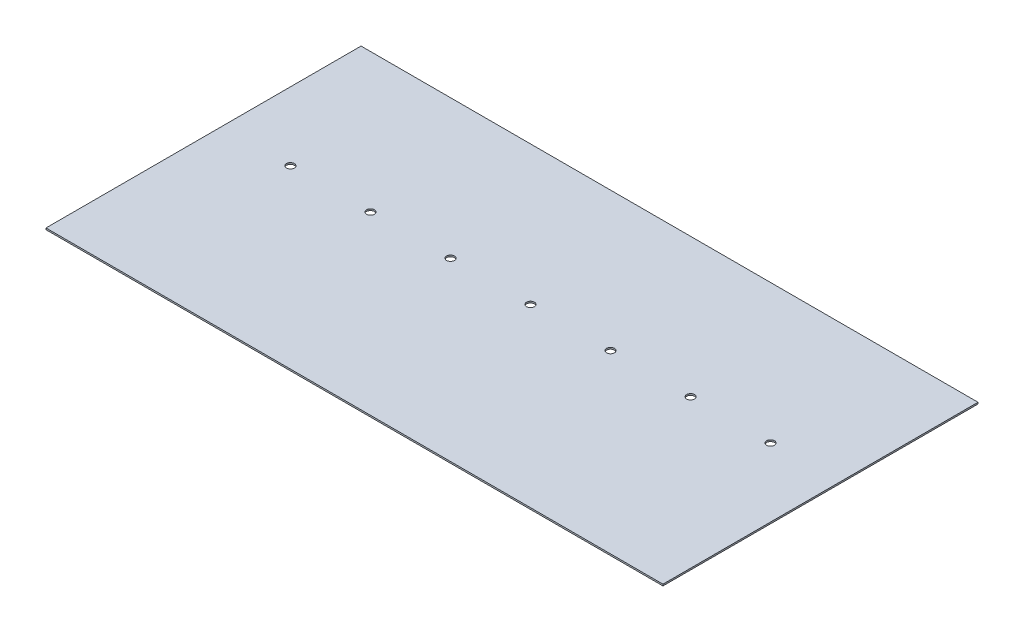
ISO-10303-21;
HEADER;
FILE_DESCRIPTION(('STEP AP214'),'2;1');
FILE_NAME('part.step','',(''),(''),'','','');
FILE_SCHEMA(('AUTOMOTIVE_DESIGN { 1 0 10303 214 1 1 1 1 }'));
ENDSEC;
DATA;
#1=APPLICATION_CONTEXT('core data for automotive mechanical design processes');
#2=APPLICATION_PROTOCOL_DEFINITION('international standard','automotive_design',2000,#1);
#3=PRODUCT_CONTEXT('',#1,'mechanical');
#4=PRODUCT('Part','Part','',(#3));
#5=PRODUCT_RELATED_PRODUCT_CATEGORY('part','',(#4));
#6=PRODUCT_DEFINITION_FORMATION('','',#4);
#7=PRODUCT_DEFINITION_CONTEXT('part definition',#1,'design');
#8=PRODUCT_DEFINITION('design','',#6,#7);
#9=PRODUCT_DEFINITION_SHAPE('','',#8);
#10=(LENGTH_UNIT() NAMED_UNIT(*) SI_UNIT(.MILLI.,.METRE.));
#11=(NAMED_UNIT(*) PLANE_ANGLE_UNIT() SI_UNIT($,.RADIAN.));
#12=(NAMED_UNIT(*) SI_UNIT($,.STERADIAN.) SOLID_ANGLE_UNIT());
#13=UNCERTAINTY_MEASURE_WITH_UNIT(LENGTH_MEASURE(1.E-05),#10,'distance_accuracy_value','');
#14=(GEOMETRIC_REPRESENTATION_CONTEXT(3) GLOBAL_UNCERTAINTY_ASSIGNED_CONTEXT((#13)) GLOBAL_UNIT_ASSIGNED_CONTEXT((#10,
#11,#12)) REPRESENTATION_CONTEXT('',''));
#15=CARTESIAN_POINT('',(0.,0.,0.));
#16=DIRECTION('',(0.,0.,1.));
#17=DIRECTION('',(1.,0.,0.));
#18=AXIS2_PLACEMENT_3D('',#15,#16,#17);
#19=CARTESIAN_POINT('',(391.668,-1.,0.));
#20=DIRECTION('',(-1.,0.,0.));
#21=DIRECTION('',(0.,0.,1.));
#22=AXIS2_PLACEMENT_3D('',#19,#20,#21);
#23=PLANE('',#22);
#24=DIRECTION('',(0.,0.,1.));
#25=VECTOR('',#24,1.);
#26=CARTESIAN_POINT('',(391.668,0.,0.));
#27=LINE('',#26,#25);
#28=CARTESIAN_POINT('',(391.668,0.,0.));
#29=VERTEX_POINT('',#28);
#30=CARTESIAN_POINT('',(391.668,0.,199.9996));
#31=VERTEX_POINT('',#30);
#32=EDGE_CURVE('E118',#29,#31,#27,.T.);
#33=ORIENTED_EDGE('',*,*,#32,.T.);
#34=DIRECTION('',(0.,1.,0.));
#35=VECTOR('',#34,1.);
#36=CARTESIAN_POINT('',(391.668,-1.,199.9996));
#37=LINE('',#36,#35);
#38=CARTESIAN_POINT('',(391.668,-1.,199.9996));
#39=VERTEX_POINT('',#38);
#40=EDGE_CURVE('E11',#39,#31,#37,.T.);
#41=ORIENTED_EDGE('',*,*,#40,.F.);
#42=DIRECTION('',(0.,0.,1.));
#43=VECTOR('',#42,1.);
#44=CARTESIAN_POINT('',(391.668,-1.,0.));
#45=LINE('',#44,#43);
#46=CARTESIAN_POINT('',(391.668,-1.,0.));
#47=VERTEX_POINT('',#46);
#48=EDGE_CURVE('E53',#47,#39,#45,.T.);
#49=ORIENTED_EDGE('',*,*,#48,.F.);
#50=DIRECTION('',(0.,1.,0.));
#51=VECTOR('',#50,1.);
#52=CARTESIAN_POINT('',(391.668,-1.,0.));
#53=LINE('',#52,#51);
#54=EDGE_CURVE('E38',#47,#29,#53,.T.);
#55=ORIENTED_EDGE('',*,*,#54,.T.);
#56=EDGE_LOOP('',(#33,#41,#49,#55));
#57=FACE_BOUND('',#56,.T.);
#58=ADVANCED_FACE('F34',(#57),#23,.F.);
#59=CARTESIAN_POINT('',(0.,-1.,199.9996));
#60=DIRECTION('',(0.,0.,1.));
#61=DIRECTION('',(1.,0.,0.));
#62=AXIS2_PLACEMENT_3D('',#59,#60,#61);
#63=PLANE('',#62);
#64=DIRECTION('',(1.,0.,0.));
#65=VECTOR('',#64,1.);
#66=CARTESIAN_POINT('',(0.,0.,199.9996));
#67=LINE('',#66,#65);
#68=CARTESIAN_POINT('',(0.,0.,199.9996));
#69=VERTEX_POINT('',#68);
#70=EDGE_CURVE('E123',#69,#31,#67,.T.);
#71=ORIENTED_EDGE('',*,*,#70,.F.);
#72=DIRECTION('',(0.,1.,0.));
#73=VECTOR('',#72,1.);
#74=CARTESIAN_POINT('',(0.,-1.,199.9996));
#75=LINE('',#74,#73);
#76=CARTESIAN_POINT('',(0.,-1.,199.9996));
#77=VERTEX_POINT('',#76);
#78=EDGE_CURVE('E44',#77,#69,#75,.T.);
#79=ORIENTED_EDGE('',*,*,#78,.F.);
#80=DIRECTION('',(1.,0.,0.));
#81=VECTOR('',#80,1.);
#82=CARTESIAN_POINT('',(0.,-1.,199.9996));
#83=LINE('',#82,#81);
#84=EDGE_CURVE('E92',#77,#39,#83,.T.);
#85=ORIENTED_EDGE('',*,*,#84,.T.);
#86=ORIENTED_EDGE('',*,*,#40,.T.);
#87=EDGE_LOOP('',(#71,#79,#85,#86));
#88=FACE_BOUND('',#87,.T.);
#89=ADVANCED_FACE('F166',(#88),#63,.T.);
#90=CARTESIAN_POINT('',(0.,-1.,0.));
#91=DIRECTION('',(-1.,0.,0.));
#92=DIRECTION('',(0.,0.,1.));
#93=AXIS2_PLACEMENT_3D('',#90,#91,#92);
#94=PLANE('',#93);
#95=DIRECTION('',(0.,0.,1.));
#96=VECTOR('',#95,1.);
#97=CARTESIAN_POINT('',(0.,0.,0.));
#98=LINE('',#97,#96);
#99=CARTESIAN_POINT('',(0.,0.,0.));
#100=VERTEX_POINT('',#99);
#101=EDGE_CURVE('E85',#100,#69,#98,.T.);
#102=ORIENTED_EDGE('',*,*,#101,.F.);
#103=DIRECTION('',(0.,1.,0.));
#104=VECTOR('',#103,1.);
#105=CARTESIAN_POINT('',(0.,-1.,0.));
#106=LINE('',#105,#104);
#107=CARTESIAN_POINT('',(0.,-1.,0.));
#108=VERTEX_POINT('',#107);
#109=EDGE_CURVE('E82',#108,#100,#106,.T.);
#110=ORIENTED_EDGE('',*,*,#109,.F.);
#111=DIRECTION('',(0.,0.,1.));
#112=VECTOR('',#111,1.);
#113=CARTESIAN_POINT('',(0.,-1.,0.));
#114=LINE('',#113,#112);
#115=EDGE_CURVE('E84',#108,#77,#114,.T.);
#116=ORIENTED_EDGE('',*,*,#115,.T.);
#117=ORIENTED_EDGE('',*,*,#78,.T.);
#118=EDGE_LOOP('',(#102,#110,#116,#117));
#119=FACE_BOUND('',#118,.T.);
#120=ADVANCED_FACE('F83',(#119),#94,.T.);
#121=CARTESIAN_POINT('',(195.834,-1.,88.2396));
#122=DIRECTION('',(0.,1.,0.));
#123=DIRECTION('',(0.,0.,1.));
#124=AXIS2_PLACEMENT_3D('',#121,#122,#123);
#125=CYLINDRICAL_SURFACE('',#124,2.5);
#126=CARTESIAN_POINT('',(195.834,-1.,88.2396));
#127=DIRECTION('',(0.,1.,0.));
#128=DIRECTION('',(0.,0.,1.));
#129=AXIS2_PLACEMENT_3D('',#126,#127,#128);
#130=CIRCLE('',#129,2.5);
#131=CARTESIAN_POINT('',(195.834,-1.,90.7396));
#132=VERTEX_POINT('',#131);
#133=EDGE_CURVE('E149',#132,#132,#130,.T.);
#134=ORIENTED_EDGE('',*,*,#133,.F.);
#135=EDGE_LOOP('',(#134));
#136=FACE_BOUND('',#135,.T.);
#137=CARTESIAN_POINT('',(195.834,0.,88.2396));
#138=DIRECTION('',(0.,1.,0.));
#139=DIRECTION('',(0.,0.,1.));
#140=AXIS2_PLACEMENT_3D('',#137,#138,#139);
#141=CIRCLE('',#140,2.5);
#142=CARTESIAN_POINT('',(195.834,0.,90.7396));
#143=VERTEX_POINT('',#142);
#144=EDGE_CURVE('E115',#143,#143,#141,.T.);
#145=ORIENTED_EDGE('',*,*,#144,.T.);
#146=EDGE_LOOP('',(#145));
#147=FACE_BOUND('',#146,.T.);
#148=ADVANCED_FACE('F154',(#136,#147),#125,.F.);
#149=CARTESIAN_POINT('',(145.034,-1.,88.2396));
#150=DIRECTION('',(0.,1.,0.));
#151=DIRECTION('',(0.,0.,1.));
#152=AXIS2_PLACEMENT_3D('',#149,#150,#151);
#153=CYLINDRICAL_SURFACE('',#152,2.49999999999997);
#154=CARTESIAN_POINT('',(145.034,-1.,88.2396));
#155=DIRECTION('',(0.,1.,0.));
#156=DIRECTION('',(0.,0.,1.));
#157=AXIS2_PLACEMENT_3D('',#154,#155,#156);
#158=CIRCLE('',#157,2.49999999999997);
#159=CARTESIAN_POINT('',(145.034,-1.,90.7396));
#160=VERTEX_POINT('',#159);
#161=EDGE_CURVE('E146',#160,#160,#158,.T.);
#162=ORIENTED_EDGE('',*,*,#161,.F.);
#163=EDGE_LOOP('',(#162));
#164=FACE_BOUND('',#163,.T.);
#165=CARTESIAN_POINT('',(145.034,0.,88.2396));
#166=DIRECTION('',(0.,1.,0.));
#167=DIRECTION('',(0.,0.,1.));
#168=AXIS2_PLACEMENT_3D('',#165,#166,#167);
#169=CIRCLE('',#168,2.49999999999997);
#170=CARTESIAN_POINT('',(145.034,0.,90.7396));
#171=VERTEX_POINT('',#170);
#172=EDGE_CURVE('E112',#171,#171,#169,.T.);
#173=ORIENTED_EDGE('',*,*,#172,.T.);
#174=EDGE_LOOP('',(#173));
#175=FACE_BOUND('',#174,.T.);
#176=ADVANCED_FACE('F157',(#164,#175),#153,.F.);
#177=CARTESIAN_POINT('',(94.234,-1.,88.2396));
#178=DIRECTION('',(0.,1.,0.));
#179=DIRECTION('',(0.,0.,1.));
#180=AXIS2_PLACEMENT_3D('',#177,#178,#179);
#181=CYLINDRICAL_SURFACE('',#180,2.5);
#182=CARTESIAN_POINT('',(94.234,-1.,88.2396));
#183=DIRECTION('',(0.,1.,0.));
#184=DIRECTION('',(0.,0.,1.));
#185=AXIS2_PLACEMENT_3D('',#182,#183,#184);
#186=CIRCLE('',#185,2.5);
#187=CARTESIAN_POINT('',(94.234,-1.,90.7396));
#188=VERTEX_POINT('',#187);
#189=EDGE_CURVE('E143',#188,#188,#186,.T.);
#190=ORIENTED_EDGE('',*,*,#189,.F.);
#191=EDGE_LOOP('',(#190));
#192=FACE_BOUND('',#191,.T.);
#193=CARTESIAN_POINT('',(94.234,0.,88.2396));
#194=DIRECTION('',(0.,1.,0.));
#195=DIRECTION('',(0.,0.,1.));
#196=AXIS2_PLACEMENT_3D('',#193,#194,#195);
#197=CIRCLE('',#196,2.5);
#198=CARTESIAN_POINT('',(94.234,0.,90.7396));
#199=VERTEX_POINT('',#198);
#200=EDGE_CURVE('E109',#199,#199,#197,.T.);
#201=ORIENTED_EDGE('',*,*,#200,.T.);
#202=EDGE_LOOP('',(#201));
#203=FACE_BOUND('',#202,.T.);
#204=ADVANCED_FACE('F181',(#192,#203),#181,.F.);
#205=CARTESIAN_POINT('',(43.434,-1.,88.2396));
#206=DIRECTION('',(0.,1.,0.));
#207=DIRECTION('',(0.,0.,1.));
#208=AXIS2_PLACEMENT_3D('',#205,#206,#207);
#209=CYLINDRICAL_SURFACE('',#208,2.5);
#210=CARTESIAN_POINT('',(43.434,-1.,88.2396));
#211=DIRECTION('',(0.,1.,0.));
#212=DIRECTION('',(0.,0.,1.));
#213=AXIS2_PLACEMENT_3D('',#210,#211,#212);
#214=CIRCLE('',#213,2.5);
#215=CARTESIAN_POINT('',(43.434,-1.,90.7396));
#216=VERTEX_POINT('',#215);
#217=EDGE_CURVE('E140',#216,#216,#214,.T.);
#218=ORIENTED_EDGE('',*,*,#217,.F.);
#219=EDGE_LOOP('',(#218));
#220=FACE_BOUND('',#219,.T.);
#221=CARTESIAN_POINT('',(43.434,0.,88.2396));
#222=DIRECTION('',(0.,1.,0.));
#223=DIRECTION('',(0.,0.,1.));
#224=AXIS2_PLACEMENT_3D('',#221,#222,#223);
#225=CIRCLE('',#224,2.5);
#226=CARTESIAN_POINT('',(43.434,0.,90.7396));
#227=VERTEX_POINT('',#226);
#228=EDGE_CURVE('E106',#227,#227,#225,.T.);
#229=ORIENTED_EDGE('',*,*,#228,.T.);
#230=EDGE_LOOP('',(#229));
#231=FACE_BOUND('',#230,.T.);
#232=ADVANCED_FACE('F185',(#220,#231),#209,.F.);
#233=CARTESIAN_POINT('',(246.634,-1.,88.2396));
#234=DIRECTION('',(0.,1.,0.));
#235=DIRECTION('',(0.,0.,1.));
#236=AXIS2_PLACEMENT_3D('',#233,#234,#235);
#237=CYLINDRICAL_SURFACE('',#236,2.50000000000002);
#238=CARTESIAN_POINT('',(246.634,-1.,88.2396));
#239=DIRECTION('',(0.,1.,0.));
#240=DIRECTION('',(0.,0.,1.));
#241=AXIS2_PLACEMENT_3D('',#238,#239,#240);
#242=CIRCLE('',#241,2.50000000000002);
#243=CARTESIAN_POINT('',(246.634,-1.,90.7396));
#244=VERTEX_POINT('',#243);
#245=EDGE_CURVE('E135',#244,#244,#242,.T.);
#246=ORIENTED_EDGE('',*,*,#245,.F.);
#247=EDGE_LOOP('',(#246));
#248=FACE_BOUND('',#247,.T.);
#249=CARTESIAN_POINT('',(246.634,0.,88.2396));
#250=DIRECTION('',(0.,1.,0.));
#251=DIRECTION('',(0.,0.,1.));
#252=AXIS2_PLACEMENT_3D('',#249,#250,#251);
#253=CIRCLE('',#252,2.50000000000002);
#254=CARTESIAN_POINT('',(246.634,0.,90.7396));
#255=VERTEX_POINT('',#254);
#256=EDGE_CURVE('E103',#255,#255,#253,.T.);
#257=ORIENTED_EDGE('',*,*,#256,.T.);
#258=EDGE_LOOP('',(#257));
#259=FACE_BOUND('',#258,.T.);
#260=ADVANCED_FACE('F189',(#248,#259),#237,.F.);
#261=CARTESIAN_POINT('',(297.434,-1.,88.2396));
#262=DIRECTION('',(0.,1.,0.));
#263=DIRECTION('',(0.,0.,1.));
#264=AXIS2_PLACEMENT_3D('',#261,#262,#263);
#265=CYLINDRICAL_SURFACE('',#264,2.49999999999997);
#266=CARTESIAN_POINT('',(297.434,-1.,88.2396));
#267=DIRECTION('',(0.,1.,0.));
#268=DIRECTION('',(0.,0.,1.));
#269=AXIS2_PLACEMENT_3D('',#266,#267,#268);
#270=CIRCLE('',#269,2.49999999999997);
#271=CARTESIAN_POINT('',(297.434,-1.,90.7396));
#272=VERTEX_POINT('',#271);
#273=EDGE_CURVE('E130',#272,#272,#270,.T.);
#274=ORIENTED_EDGE('',*,*,#273,.F.);
#275=EDGE_LOOP('',(#274));
#276=FACE_BOUND('',#275,.T.);
#277=CARTESIAN_POINT('',(297.434,0.,88.2396));
#278=DIRECTION('',(0.,1.,0.));
#279=DIRECTION('',(0.,0.,1.));
#280=AXIS2_PLACEMENT_3D('',#277,#278,#279);
#281=CIRCLE('',#280,2.49999999999997);
#282=CARTESIAN_POINT('',(297.434,0.,90.7396));
#283=VERTEX_POINT('',#282);
#284=EDGE_CURVE('E100',#283,#283,#281,.T.);
#285=ORIENTED_EDGE('',*,*,#284,.T.);
#286=EDGE_LOOP('',(#285));
#287=FACE_BOUND('',#286,.T.);
#288=ADVANCED_FACE('F192',(#276,#287),#265,.F.);
#289=CARTESIAN_POINT('',(348.234,-1.,88.2396));
#290=DIRECTION('',(0.,1.,0.));
#291=DIRECTION('',(0.,0.,1.));
#292=AXIS2_PLACEMENT_3D('',#289,#290,#291);
#293=CYLINDRICAL_SURFACE('',#292,2.50000000000002);
#294=CARTESIAN_POINT('',(348.234,-1.,88.2396));
#295=DIRECTION('',(0.,1.,0.));
#296=DIRECTION('',(0.,0.,1.));
#297=AXIS2_PLACEMENT_3D('',#294,#295,#296);
#298=CIRCLE('',#297,2.50000000000002);
#299=CARTESIAN_POINT('',(348.234,-1.,90.7396));
#300=VERTEX_POINT('',#299);
#301=EDGE_CURVE('E125',#300,#300,#298,.T.);
#302=ORIENTED_EDGE('',*,*,#301,.F.);
#303=EDGE_LOOP('',(#302));
#304=FACE_BOUND('',#303,.T.);
#305=CARTESIAN_POINT('',(348.234,0.,88.2396));
#306=DIRECTION('',(0.,1.,0.));
#307=DIRECTION('',(0.,0.,1.));
#308=AXIS2_PLACEMENT_3D('',#305,#306,#307);
#309=CIRCLE('',#308,2.50000000000002);
#310=CARTESIAN_POINT('',(348.234,0.,90.7396));
#311=VERTEX_POINT('',#310);
#312=EDGE_CURVE('E97',#311,#311,#309,.T.);
#313=ORIENTED_EDGE('',*,*,#312,.T.);
#314=EDGE_LOOP('',(#313));
#315=FACE_BOUND('',#314,.T.);
#316=ADVANCED_FACE('F36',(#304,#315),#293,.F.);
#317=CARTESIAN_POINT('',(0.,-1.,0.));
#318=DIRECTION('',(0.,0.,1.));
#319=DIRECTION('',(1.,0.,0.));
#320=AXIS2_PLACEMENT_3D('',#317,#318,#319);
#321=PLANE('',#320);
#322=DIRECTION('',(1.,0.,0.));
#323=VECTOR('',#322,1.);
#324=CARTESIAN_POINT('',(0.,0.,0.));
#325=LINE('',#324,#323);
#326=EDGE_CURVE('E120',#100,#29,#325,.T.);
#327=ORIENTED_EDGE('',*,*,#326,.T.);
#328=ORIENTED_EDGE('',*,*,#54,.F.);
#329=DIRECTION('',(1.,0.,0.));
#330=VECTOR('',#329,1.);
#331=CARTESIAN_POINT('',(0.,-1.,0.));
#332=LINE('',#331,#330);
#333=EDGE_CURVE('E79',#108,#47,#332,.T.);
#334=ORIENTED_EDGE('',*,*,#333,.F.);
#335=ORIENTED_EDGE('',*,*,#109,.T.);
#336=EDGE_LOOP('',(#327,#328,#334,#335));
#337=FACE_BOUND('',#336,.T.);
#338=ADVANCED_FACE('F88',(#337),#321,.F.);
#339=CARTESIAN_POINT('',(0.,-1.,0.));
#340=DIRECTION('',(0.,1.,0.));
#341=DIRECTION('',(0.,0.,1.));
#342=AXIS2_PLACEMENT_3D('',#339,#340,#341);
#343=PLANE('',#342);
#344=ORIENTED_EDGE('',*,*,#301,.T.);
#345=EDGE_LOOP('',(#344));
#346=FACE_BOUND('',#345,.T.);
#347=ORIENTED_EDGE('',*,*,#273,.T.);
#348=EDGE_LOOP('',(#347));
#349=FACE_BOUND('',#348,.T.);
#350=ORIENTED_EDGE('',*,*,#245,.T.);
#351=EDGE_LOOP('',(#350));
#352=FACE_BOUND('',#351,.T.);
#353=ORIENTED_EDGE('',*,*,#217,.T.);
#354=EDGE_LOOP('',(#353));
#355=FACE_BOUND('',#354,.T.);
#356=ORIENTED_EDGE('',*,*,#189,.T.);
#357=EDGE_LOOP('',(#356));
#358=FACE_BOUND('',#357,.T.);
#359=ORIENTED_EDGE('',*,*,#161,.T.);
#360=EDGE_LOOP('',(#359));
#361=FACE_BOUND('',#360,.T.);
#362=ORIENTED_EDGE('',*,*,#133,.T.);
#363=EDGE_LOOP('',(#362));
#364=FACE_BOUND('',#363,.T.);
#365=ORIENTED_EDGE('',*,*,#48,.T.);
#366=ORIENTED_EDGE('',*,*,#84,.F.);
#367=ORIENTED_EDGE('',*,*,#115,.F.);
#368=ORIENTED_EDGE('',*,*,#333,.T.);
#369=EDGE_LOOP('',(#365,#366,#367,#368));
#370=FACE_BOUND('',#369,.T.);
#371=ADVANCED_FACE('F91',(#346,#349,#352,#355,#358,#361,#364,#370),#343,.F.);
#372=CARTESIAN_POINT('',(0.,0.,0.));
#373=DIRECTION('',(0.,1.,0.));
#374=DIRECTION('',(0.,0.,1.));
#375=AXIS2_PLACEMENT_3D('',#372,#373,#374);
#376=PLANE('',#375);
#377=ORIENTED_EDGE('',*,*,#312,.F.);
#378=EDGE_LOOP('',(#377));
#379=FACE_BOUND('',#378,.T.);
#380=ORIENTED_EDGE('',*,*,#284,.F.);
#381=EDGE_LOOP('',(#380));
#382=FACE_BOUND('',#381,.T.);
#383=ORIENTED_EDGE('',*,*,#256,.F.);
#384=EDGE_LOOP('',(#383));
#385=FACE_BOUND('',#384,.T.);
#386=ORIENTED_EDGE('',*,*,#228,.F.);
#387=EDGE_LOOP('',(#386));
#388=FACE_BOUND('',#387,.T.);
#389=ORIENTED_EDGE('',*,*,#200,.F.);
#390=EDGE_LOOP('',(#389));
#391=FACE_BOUND('',#390,.T.);
#392=ORIENTED_EDGE('',*,*,#172,.F.);
#393=EDGE_LOOP('',(#392));
#394=FACE_BOUND('',#393,.T.);
#395=ORIENTED_EDGE('',*,*,#144,.F.);
#396=EDGE_LOOP('',(#395));
#397=FACE_BOUND('',#396,.T.);
#398=ORIENTED_EDGE('',*,*,#32,.F.);
#399=ORIENTED_EDGE('',*,*,#326,.F.);
#400=ORIENTED_EDGE('',*,*,#101,.T.);
#401=ORIENTED_EDGE('',*,*,#70,.T.);
#402=EDGE_LOOP('',(#398,#399,#400,#401));
#403=FACE_BOUND('',#402,.T.);
#404=ADVANCED_FACE('F161',(#379,#382,#385,#388,#391,#394,#397,#403),#376,.T.);
#405=CLOSED_SHELL('',(#58,#89,#120,#148,#176,#204,#232,#260,#288,#316,#338,#371,#404));
#406=MANIFOLD_SOLID_BREP('B2',#405);
#407=ADVANCED_BREP_SHAPE_REPRESENTATION('',(#18,#406),#14);
#408=SHAPE_DEFINITION_REPRESENTATION(#9,#407);
ENDSEC;
END-ISO-10303-21;
